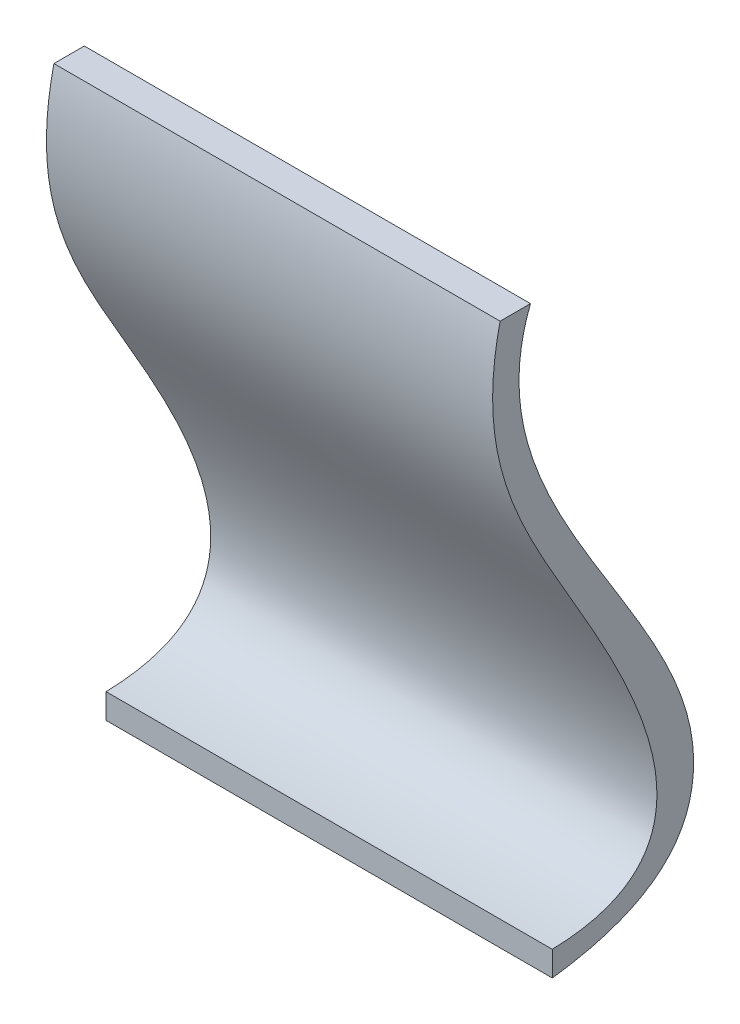
ISO-10303-21;
HEADER;
FILE_DESCRIPTION(('STEP AP214'),'2;1');
FILE_NAME('part.step','',(''),(''),'','','');
FILE_SCHEMA(('AUTOMOTIVE_DESIGN { 1 0 10303 214 1 1 1 1 }'));
ENDSEC;
DATA;
#1=APPLICATION_CONTEXT('core data for automotive mechanical design processes');
#2=APPLICATION_PROTOCOL_DEFINITION('international standard','automotive_design',2000,#1);
#3=PRODUCT_CONTEXT('',#1,'mechanical');
#4=PRODUCT('Part','Part','',(#3));
#5=PRODUCT_RELATED_PRODUCT_CATEGORY('part','',(#4));
#6=PRODUCT_DEFINITION_FORMATION('','',#4);
#7=PRODUCT_DEFINITION_CONTEXT('part definition',#1,'design');
#8=PRODUCT_DEFINITION('design','',#6,#7);
#9=PRODUCT_DEFINITION_SHAPE('','',#8);
#10=(LENGTH_UNIT() NAMED_UNIT(*) SI_UNIT(.MILLI.,.METRE.));
#11=(NAMED_UNIT(*) PLANE_ANGLE_UNIT() SI_UNIT($,.RADIAN.));
#12=(NAMED_UNIT(*) SI_UNIT($,.STERADIAN.) SOLID_ANGLE_UNIT());
#13=UNCERTAINTY_MEASURE_WITH_UNIT(LENGTH_MEASURE(1.E-05),#10,'distance_accuracy_value','');
#14=(GEOMETRIC_REPRESENTATION_CONTEXT(3) GLOBAL_UNCERTAINTY_ASSIGNED_CONTEXT((#13)) GLOBAL_UNIT_ASSIGNED_CONTEXT((#10,
#11,#12)) REPRESENTATION_CONTEXT('',''));
#15=CARTESIAN_POINT('',(0.,0.,0.));
#16=DIRECTION('',(0.,0.,1.));
#17=DIRECTION('',(1.,0.,0.));
#18=AXIS2_PLACEMENT_3D('',#15,#16,#17);
#19=CARTESIAN_POINT('',(3.,0.16727567744681,0.));
#20=CARTESIAN_POINT('',(3.,0.192327668750511,-1.00071912129873));
#21=CARTESIAN_POINT('',(3.,2.06614201046885,-0.382421828312801));
#22=CARTESIAN_POINT('',(3.,3.04939789869086,0.570185680963311));
#23=CARTESIAN_POINT('',(3.,4.,0.350817420000002));
#24=B_SPLINE_CURVE_WITH_KNOTS('',3,(#19,#20,#21,#22,#23),.UNSPECIFIED.,.F.,.F.,(4,1,4),(0.,
0.429244298503861,1.),.UNSPECIFIED.);
#25=DIRECTION('',(-1.,0.,0.));
#26=VECTOR('',#25,1.);
#27=SURFACE_OF_LINEAR_EXTRUSION('',#24,#26);
#28=CARTESIAN_POINT('',(0.,0.16727567744681,0.));
#29=CARTESIAN_POINT('',(0.,0.192327668750511,-1.00071912129873));
#30=CARTESIAN_POINT('',(0.,2.06614201046885,-0.382421828312801));
#31=CARTESIAN_POINT('',(0.,3.04939789869086,0.570185680963311));
#32=CARTESIAN_POINT('',(0.,4.,0.350817420000002));
#33=B_SPLINE_CURVE_WITH_KNOTS('',3,(#28,#29,#30,#31,#32),.UNSPECIFIED.,.F.,.F.,(4,1,4),(0.,
0.429244298503861,1.),.UNSPECIFIED.);
#34=CARTESIAN_POINT('',(0.,0.16727567744681,0.));
#35=VERTEX_POINT('',#34);
#36=CARTESIAN_POINT('',(0.,4.,0.350817420000002));
#37=VERTEX_POINT('',#36);
#38=EDGE_CURVE('E118',#35,#37,#33,.T.);
#39=ORIENTED_EDGE('',*,*,#38,.F.);
#40=DIRECTION('',(-1.,0.,0.));
#41=VECTOR('',#40,1.);
#42=CARTESIAN_POINT('',(3.,0.16727567744681,0.));
#43=LINE('',#42,#41);
#44=CARTESIAN_POINT('',(3.,0.16727567744681,0.));
#45=VERTEX_POINT('',#44);
#46=EDGE_CURVE('E11',#45,#35,#43,.T.);
#47=ORIENTED_EDGE('',*,*,#46,.F.);
#48=CARTESIAN_POINT('',(3.,4.,0.350817420000002));
#49=VERTEX_POINT('',#48);
#50=EDGE_CURVE('E93',#45,#49,#24,.T.);
#51=ORIENTED_EDGE('',*,*,#50,.T.);
#52=DIRECTION('',(-1.,0.,0.));
#53=VECTOR('',#52,1.);
#54=CARTESIAN_POINT('',(3.,4.,0.350817420000002));
#55=LINE('',#54,#53);
#56=EDGE_CURVE('E51',#49,#37,#55,.T.);
#57=ORIENTED_EDGE('',*,*,#56,.T.);
#58=EDGE_LOOP('',(#39,#47,#51,#57));
#59=FACE_BOUND('',#58,.T.);
#60=ADVANCED_FACE('F34',(#59),#27,.T.);
#61=CARTESIAN_POINT('',(3.,0.,0.));
#62=DIRECTION('',(0.,0.,1.));
#63=DIRECTION('',(1.,0.,0.));
#64=AXIS2_PLACEMENT_3D('',#61,#62,#63);
#65=PLANE('',#64);
#66=DIRECTION('',(0.,1.,0.));
#67=VECTOR('',#66,1.);
#68=CARTESIAN_POINT('',(0.,0.,0.));
#69=LINE('',#68,#67);
#70=CARTESIAN_POINT('',(0.,0.,0.));
#71=VERTEX_POINT('',#70);
#72=EDGE_CURVE('E83',#71,#35,#69,.T.);
#73=ORIENTED_EDGE('',*,*,#72,.F.);
#74=DIRECTION('',(-1.,0.,0.));
#75=VECTOR('',#74,1.);
#76=CARTESIAN_POINT('',(3.,0.,0.));
#77=LINE('',#76,#75);
#78=CARTESIAN_POINT('',(3.,0.,0.));
#79=VERTEX_POINT('',#78);
#80=EDGE_CURVE('E43',#79,#71,#77,.T.);
#81=ORIENTED_EDGE('',*,*,#80,.F.);
#82=DIRECTION('',(0.,1.,0.));
#83=VECTOR('',#82,1.);
#84=CARTESIAN_POINT('',(3.,0.,0.));
#85=LINE('',#84,#83);
#86=EDGE_CURVE('E81',#79,#45,#85,.T.);
#87=ORIENTED_EDGE('',*,*,#86,.T.);
#88=ORIENTED_EDGE('',*,*,#46,.T.);
#89=EDGE_LOOP('',(#73,#81,#87,#88));
#90=FACE_BOUND('',#89,.T.);
#91=ADVANCED_FACE('F79',(#90),#65,.T.);
#92=CARTESIAN_POINT('',(3.,0.,0.));
#93=CARTESIAN_POINT('',(3.,0.0887035146382681,-0.709176752479321));
#94=CARTESIAN_POINT('',(3.,1.3028981043922,-1.56357897302874));
#95=CARTESIAN_POINT('',(3.,2.87076903687618,0.593062366780906));
#96=CARTESIAN_POINT('',(3.,4.,0.146433981702127));
#97=B_SPLINE_CURVE_WITH_KNOTS('',3,(#92,#93,#94,#95,#96),.UNSPECIFIED.,.F.,.F.,(4,1,4),(0.,
0.240929585924858,1.),.UNSPECIFIED.);
#98=DIRECTION('',(-1.,0.,0.));
#99=VECTOR('',#98,1.);
#100=SURFACE_OF_LINEAR_EXTRUSION('',#97,#99);
#101=CARTESIAN_POINT('',(0.,0.,0.));
#102=CARTESIAN_POINT('',(0.,0.0887035146382681,-0.709176752479321));
#103=CARTESIAN_POINT('',(0.,1.3028981043922,-1.56357897302874));
#104=CARTESIAN_POINT('',(0.,2.87076903687618,0.593062366780906));
#105=CARTESIAN_POINT('',(0.,4.,0.146433981702127));
#106=B_SPLINE_CURVE_WITH_KNOTS('',3,(#101,#102,#103,#104,#105),.UNSPECIFIED.,.F.,.F.,(4,1,4),
(0.,0.240929585924858,1.),.UNSPECIFIED.);
#107=CARTESIAN_POINT('',(0.,4.,0.146433981702129));
#108=VERTEX_POINT('',#107);
#109=EDGE_CURVE('E122',#71,#108,#106,.T.);
#110=ORIENTED_EDGE('',*,*,#109,.T.);
#111=DIRECTION('',(-1.,0.,0.));
#112=VECTOR('',#111,1.);
#113=CARTESIAN_POINT('',(3.,4.,0.146433981702129));
#114=LINE('',#113,#112);
#115=CARTESIAN_POINT('',(3.,4.,0.146433981702129));
#116=VERTEX_POINT('',#115);
#117=EDGE_CURVE('E65',#116,#108,#114,.T.);
#118=ORIENTED_EDGE('',*,*,#117,.F.);
#119=EDGE_CURVE('E86',#79,#116,#97,.T.);
#120=ORIENTED_EDGE('',*,*,#119,.F.);
#121=ORIENTED_EDGE('',*,*,#80,.T.);
#122=EDGE_LOOP('',(#110,#118,#120,#121));
#123=FACE_BOUND('',#122,.T.);
#124=ADVANCED_FACE('F87',(#123),#100,.F.);
#125=CARTESIAN_POINT('',(3.,4.,0.));
#126=DIRECTION('',(0.,1.,0.));
#127=DIRECTION('',(0.,0.,1.));
#128=AXIS2_PLACEMENT_3D('',#125,#126,#127);
#129=PLANE('',#128);
#130=DIRECTION('',(0.,0.,-1.));
#131=VECTOR('',#130,1.);
#132=CARTESIAN_POINT('',(0.,4.,0.));
#133=LINE('',#132,#131);
#134=EDGE_CURVE('E95',#37,#108,#133,.T.);
#135=ORIENTED_EDGE('',*,*,#134,.F.);
#136=ORIENTED_EDGE('',*,*,#56,.F.);
#137=DIRECTION('',(0.,0.,-1.));
#138=VECTOR('',#137,1.);
#139=CARTESIAN_POINT('',(3.,4.,0.));
#140=LINE('',#139,#138);
#141=EDGE_CURVE('E90',#49,#116,#140,.T.);
#142=ORIENTED_EDGE('',*,*,#141,.T.);
#143=ORIENTED_EDGE('',*,*,#117,.T.);
#144=EDGE_LOOP('',(#135,#136,#142,#143));
#145=FACE_BOUND('',#144,.T.);
#146=ADVANCED_FACE('F110',(#145),#129,.T.);
#147=CARTESIAN_POINT('',(3.,0.,0.));
#148=DIRECTION('',(1.,0.,0.));
#149=DIRECTION('',(0.,0.,-1.));
#150=AXIS2_PLACEMENT_3D('',#147,#148,#149);
#151=PLANE('',#150);
#152=ORIENTED_EDGE('',*,*,#50,.F.);
#153=ORIENTED_EDGE('',*,*,#86,.F.);
#154=ORIENTED_EDGE('',*,*,#119,.T.);
#155=ORIENTED_EDGE('',*,*,#141,.F.);
#156=EDGE_LOOP('',(#152,#153,#154,#155));
#157=FACE_BOUND('',#156,.T.);
#158=ADVANCED_FACE('F92',(#157),#151,.T.);
#159=CARTESIAN_POINT('',(0.,0.,0.));
#160=DIRECTION('',(1.,0.,0.));
#161=DIRECTION('',(0.,0.,-1.));
#162=AXIS2_PLACEMENT_3D('',#159,#160,#161);
#163=PLANE('',#162);
#164=ORIENTED_EDGE('',*,*,#38,.T.);
#165=ORIENTED_EDGE('',*,*,#134,.T.);
#166=ORIENTED_EDGE('',*,*,#109,.F.);
#167=ORIENTED_EDGE('',*,*,#72,.T.);
#168=EDGE_LOOP('',(#164,#165,#166,#167));
#169=FACE_BOUND('',#168,.T.);
#170=ADVANCED_FACE('F121',(#169),#163,.F.);
#171=CLOSED_SHELL('',(#60,#91,#124,#146,#158,#170));
#172=MANIFOLD_SOLID_BREP('B2',#171);
#173=ADVANCED_BREP_SHAPE_REPRESENTATION('',(#18,#172),#14);
#174=SHAPE_DEFINITION_REPRESENTATION(#9,#173);
ENDSEC;
END-ISO-10303-21;
